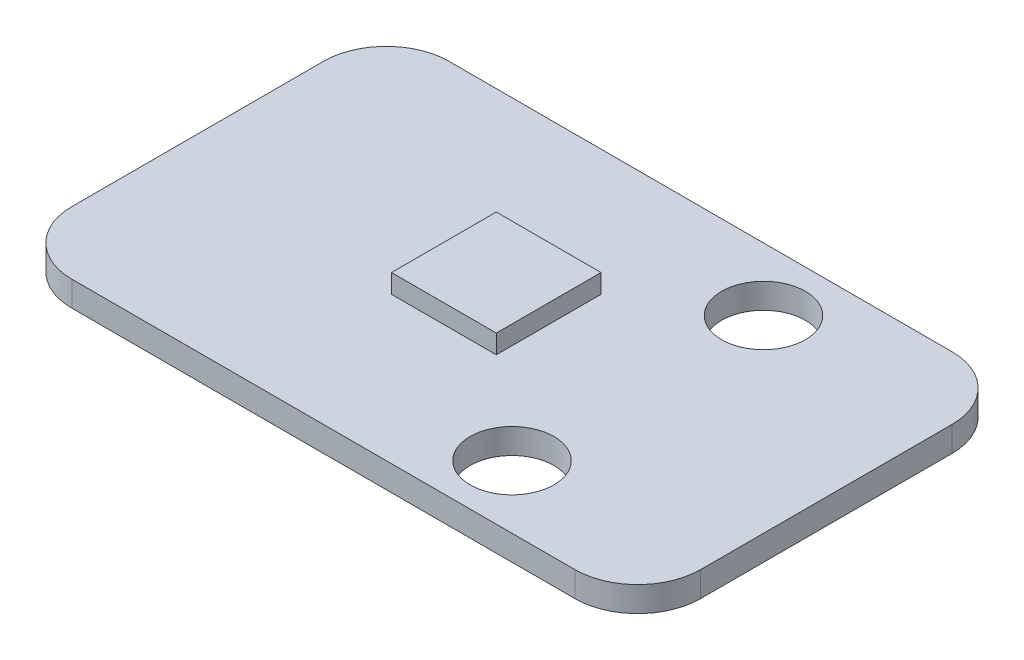
ISO-10303-21;
HEADER;
FILE_DESCRIPTION(('STEP AP214'),'2;1');
FILE_NAME('part.step','',(''),(''),'','','');
FILE_SCHEMA(('AUTOMOTIVE_DESIGN { 1 0 10303 214 1 1 1 1 }'));
ENDSEC;
DATA;
#1=APPLICATION_CONTEXT('core data for automotive mechanical design processes');
#2=APPLICATION_PROTOCOL_DEFINITION('international standard','automotive_design',2000,#1);
#3=PRODUCT_CONTEXT('',#1,'mechanical');
#4=PRODUCT('Part','Part','',(#3));
#5=PRODUCT_RELATED_PRODUCT_CATEGORY('part','',(#4));
#6=PRODUCT_DEFINITION_FORMATION('','',#4);
#7=PRODUCT_DEFINITION_CONTEXT('part definition',#1,'design');
#8=PRODUCT_DEFINITION('design','',#6,#7);
#9=PRODUCT_DEFINITION_SHAPE('','',#8);
#10=(LENGTH_UNIT() NAMED_UNIT(*) SI_UNIT(.MILLI.,.METRE.));
#11=(NAMED_UNIT(*) PLANE_ANGLE_UNIT() SI_UNIT($,.RADIAN.));
#12=(NAMED_UNIT(*) SI_UNIT($,.STERADIAN.) SOLID_ANGLE_UNIT());
#13=UNCERTAINTY_MEASURE_WITH_UNIT(LENGTH_MEASURE(1.E-05),#10,'distance_accuracy_value','');
#14=(GEOMETRIC_REPRESENTATION_CONTEXT(3) GLOBAL_UNCERTAINTY_ASSIGNED_CONTEXT((#13)) GLOBAL_UNIT_ASSIGNED_CONTEXT((#10,
#11,#12)) REPRESENTATION_CONTEXT('',''));
#15=CARTESIAN_POINT('',(0.,0.,0.));
#16=DIRECTION('',(0.,0.,1.));
#17=DIRECTION('',(1.,0.,0.));
#18=AXIS2_PLACEMENT_3D('',#15,#16,#17);
#19=CARTESIAN_POINT('',(-3.75,0.,2.));
#20=DIRECTION('',(0.,0.,1.));
#21=DIRECTION('',(1.,0.,0.));
#22=AXIS2_PLACEMENT_3D('',#19,#20,#21);
#23=PLANE('',#22);
#24=DIRECTION('',(0.,1.,0.));
#25=VECTOR('',#24,1.);
#26=CARTESIAN_POINT('',(1.25000000001,1.20000000001,2.00000000001));
#27=LINE('',#26,#25);
#28=CARTESIAN_POINT('',(1.25,1.20000000000001,2.));
#29=VERTEX_POINT('',#28);
#30=CARTESIAN_POINT('',(1.25,2.09999999999999,2.));
#31=VERTEX_POINT('',#30);
#32=EDGE_CURVE('E11',#29,#31,#27,.T.);
#33=ORIENTED_EDGE('',*,*,#32,.T.);
#34=DIRECTION('',(1.,0.,0.));
#35=VECTOR('',#34,1.);
#36=CARTESIAN_POINT('',(-3.75000000001,2.10000000001001,2.00000000001));
#37=LINE('',#36,#35);
#38=CARTESIAN_POINT('',(-3.75,2.09999999999999,2.));
#39=VERTEX_POINT('',#38);
#40=EDGE_CURVE('E38',#39,#31,#37,.T.);
#41=ORIENTED_EDGE('',*,*,#40,.F.);
#42=DIRECTION('',(0.,1.,0.));
#43=VECTOR('',#42,1.);
#44=CARTESIAN_POINT('',(-3.75000000001,1.20000000001,2.00000000001));
#45=LINE('',#44,#43);
#46=CARTESIAN_POINT('',(-3.75,1.20000000000001,2.));
#47=VERTEX_POINT('',#46);
#48=EDGE_CURVE('E105',#47,#39,#45,.T.);
#49=ORIENTED_EDGE('',*,*,#48,.F.);
#50=DIRECTION('',(1.,0.,0.));
#51=VECTOR('',#50,1.);
#52=CARTESIAN_POINT('',(-3.75000000001,1.20000000001,2.00000000001));
#53=LINE('',#52,#51);
#54=EDGE_CURVE('E26',#47,#29,#53,.T.);
#55=ORIENTED_EDGE('',*,*,#54,.T.);
#56=EDGE_LOOP('',(#33,#41,#49,#55));
#57=FACE_BOUND('',#56,.T.);
#58=ADVANCED_FACE('F16',(#57),#23,.T.);
#59=CARTESIAN_POINT('',(-3.75,0.,-3.));
#60=DIRECTION('',(-1.,0.,0.));
#61=DIRECTION('',(0.,0.,1.));
#62=AXIS2_PLACEMENT_3D('',#59,#60,#61);
#63=PLANE('',#62);
#64=ORIENTED_EDGE('',*,*,#48,.T.);
#65=DIRECTION('',(0.,0.,1.));
#66=VECTOR('',#65,1.);
#67=CARTESIAN_POINT('',(-3.75000000001,2.10000000001001,-3.00000000001));
#68=LINE('',#67,#66);
#69=CARTESIAN_POINT('',(-3.75,2.09999999999999,-3.));
#70=VERTEX_POINT('',#69);
#71=EDGE_CURVE('E152',#70,#39,#68,.T.);
#72=ORIENTED_EDGE('',*,*,#71,.F.);
#73=DIRECTION('',(0.,1.,0.));
#74=VECTOR('',#73,1.);
#75=CARTESIAN_POINT('',(-3.75000000001,1.20000000001,-3.00000000001));
#76=LINE('',#75,#74);
#77=CARTESIAN_POINT('',(-3.75,1.20000000000001,-3.));
#78=VERTEX_POINT('',#77);
#79=EDGE_CURVE('E201',#78,#70,#76,.T.);
#80=ORIENTED_EDGE('',*,*,#79,.F.);
#81=DIRECTION('',(0.,0.,1.));
#82=VECTOR('',#81,1.);
#83=CARTESIAN_POINT('',(-3.75000000001,1.20000000001,-3.00000000001));
#84=LINE('',#83,#82);
#85=EDGE_CURVE('E129',#78,#47,#84,.T.);
#86=ORIENTED_EDGE('',*,*,#85,.T.);
#87=EDGE_LOOP('',(#64,#72,#80,#86));
#88=FACE_BOUND('',#87,.T.);
#89=ADVANCED_FACE('F295',(#88),#63,.T.);
#90=CARTESIAN_POINT('',(1.25,0.,2.));
#91=DIRECTION('',(1.,0.,0.));
#92=DIRECTION('',(0.,1.,0.));
#93=AXIS2_PLACEMENT_3D('',#90,#91,#92);
#94=PLANE('',#93);
#95=DIRECTION('',(0.,1.,0.));
#96=VECTOR('',#95,1.);
#97=CARTESIAN_POINT('',(1.25000000001,1.20000000001,-3.00000000001));
#98=LINE('',#97,#96);
#99=CARTESIAN_POINT('',(1.25,1.20000000000001,-3.));
#100=VERTEX_POINT('',#99);
#101=CARTESIAN_POINT('',(1.25,2.09999999999999,-3.));
#102=VERTEX_POINT('',#101);
#103=EDGE_CURVE('E123',#100,#102,#98,.T.);
#104=ORIENTED_EDGE('',*,*,#103,.T.);
#105=DIRECTION('',(0.,0.,-1.));
#106=VECTOR('',#105,1.);
#107=CARTESIAN_POINT('',(1.25000000001,2.10000000001001,2.00000000001));
#108=LINE('',#107,#106);
#109=EDGE_CURVE('E117',#31,#102,#108,.T.);
#110=ORIENTED_EDGE('',*,*,#109,.F.);
#111=ORIENTED_EDGE('',*,*,#32,.F.);
#112=DIRECTION('',(0.,0.,-1.));
#113=VECTOR('',#112,1.);
#114=CARTESIAN_POINT('',(1.25000000001,1.20000000001,2.00000000001));
#115=LINE('',#114,#113);
#116=EDGE_CURVE('E115',#29,#100,#115,.T.);
#117=ORIENTED_EDGE('',*,*,#116,.T.);
#118=EDGE_LOOP('',(#104,#110,#111,#117));
#119=FACE_BOUND('',#118,.T.);
#120=ADVANCED_FACE('F114',(#119),#94,.T.);
#121=CARTESIAN_POINT('',(0.,0.,0.));
#122=DIRECTION('',(0.,1.,0.));
#123=DIRECTION('',(1.,0.,0.));
#124=AXIS2_PLACEMENT_3D('',#121,#122,#123);
#125=PLANE('',#124);
#126=DIRECTION('',(0.,0.,1.));
#127=VECTOR('',#126,1.);
#128=CARTESIAN_POINT('',(-15.00000000001,0.,-6.00000000001));
#129=LINE('',#128,#127);
#130=CARTESIAN_POINT('',(-15.,0.,-6.));
#131=VERTEX_POINT('',#130);
#132=CARTESIAN_POINT('',(-15.,0.,6.));
#133=VERTEX_POINT('',#132);
#134=EDGE_CURVE('E161',#131,#133,#129,.T.);
#135=ORIENTED_EDGE('',*,*,#134,.F.);
#136=CARTESIAN_POINT('',(-12.00000000001,0.,-6.00000000001));
#137=DIRECTION('',(0.,-1.,0.));
#138=DIRECTION('',(-1.,0.,0.));
#139=AXIS2_PLACEMENT_3D('',#136,#137,#138);
#140=CIRCLE('',#139,3.);
#141=CARTESIAN_POINT('',(-12.,0.,-9.));
#142=VERTEX_POINT('',#141);
#143=EDGE_CURVE('E124',#131,#142,#140,.T.);
#144=ORIENTED_EDGE('',*,*,#143,.T.);
#145=DIRECTION('',(-1.,0.,0.));
#146=VECTOR('',#145,1.);
#147=CARTESIAN_POINT('',(12.00000000001,0.,-9.00000000001));
#148=LINE('',#147,#146);
#149=CARTESIAN_POINT('',(12.,0.,-9.));
#150=VERTEX_POINT('',#149);
#151=EDGE_CURVE('E207',#150,#142,#148,.T.);
#152=ORIENTED_EDGE('',*,*,#151,.F.);
#153=CARTESIAN_POINT('',(12.00000000001,0.,-6.00000000001));
#154=DIRECTION('',(0.,-1.,0.));
#155=DIRECTION('',(0.,0.,-1.));
#156=AXIS2_PLACEMENT_3D('',#153,#154,#155);
#157=CIRCLE('',#156,3.);
#158=CARTESIAN_POINT('',(15.,0.,-6.));
#159=VERTEX_POINT('',#158);
#160=EDGE_CURVE('E132',#150,#159,#157,.T.);
#161=ORIENTED_EDGE('',*,*,#160,.T.);
#162=DIRECTION('',(0.,0.,-1.));
#163=VECTOR('',#162,1.);
#164=CARTESIAN_POINT('',(15.00000000001,0.,6.00000000001));
#165=LINE('',#164,#163);
#166=CARTESIAN_POINT('',(15.,0.,6.));
#167=VERTEX_POINT('',#166);
#168=EDGE_CURVE('E215',#167,#159,#165,.T.);
#169=ORIENTED_EDGE('',*,*,#168,.F.);
#170=CARTESIAN_POINT('',(12.00000000001,0.,6.00000000001));
#171=DIRECTION('',(0.,-1.,0.));
#172=DIRECTION('',(1.,0.,0.));
#173=AXIS2_PLACEMENT_3D('',#170,#171,#172);
#174=CIRCLE('',#173,3.);
#175=CARTESIAN_POINT('',(12.,0.,9.));
#176=VERTEX_POINT('',#175);
#177=EDGE_CURVE('E174',#167,#176,#174,.T.);
#178=ORIENTED_EDGE('',*,*,#177,.T.);
#179=DIRECTION('',(1.,0.,0.));
#180=VECTOR('',#179,1.);
#181=CARTESIAN_POINT('',(-12.00000000001,0.,9.00000000001));
#182=LINE('',#181,#180);
#183=CARTESIAN_POINT('',(-12.,0.,9.));
#184=VERTEX_POINT('',#183);
#185=EDGE_CURVE('E147',#184,#176,#182,.T.);
#186=ORIENTED_EDGE('',*,*,#185,.F.);
#187=CARTESIAN_POINT('',(-12.00000000001,0.,6.00000000001));
#188=DIRECTION('',(0.,-1.,0.));
#189=DIRECTION('',(0.,0.,1.));
#190=AXIS2_PLACEMENT_3D('',#187,#188,#189);
#191=CIRCLE('',#190,3.);
#192=EDGE_CURVE('E206',#184,#133,#191,.T.);
#193=ORIENTED_EDGE('',*,*,#192,.T.);
#194=EDGE_LOOP('',(#135,#144,#152,#161,#169,#178,#186,#193));
#195=FACE_BOUND('',#194,.T.);
#196=CARTESIAN_POINT('',(6.00000000001,0.,6.00000000001));
#197=DIRECTION('',(0.,1.,0.));
#198=DIRECTION('',(-1.,0.,0.));
#199=AXIS2_PLACEMENT_3D('',#196,#197,#198);
#200=CIRCLE('',#199,2.);
#201=CARTESIAN_POINT('',(4.00000000001,0.,6.00000000001));
#202=VERTEX_POINT('',#201);
#203=EDGE_CURVE('E20',#202,#202,#200,.T.);
#204=ORIENTED_EDGE('',*,*,#203,.T.);
#205=EDGE_LOOP('',(#204));
#206=FACE_BOUND('',#205,.T.);
#207=CARTESIAN_POINT('',(6.00000000001,0.,-6.00000000001));
#208=DIRECTION('',(0.,1.,0.));
#209=DIRECTION('',(-1.,0.,0.));
#210=AXIS2_PLACEMENT_3D('',#207,#208,#209);
#211=CIRCLE('',#210,2.);
#212=CARTESIAN_POINT('',(4.00000000001,0.,-6.00000000001));
#213=VERTEX_POINT('',#212);
#214=EDGE_CURVE('E228',#213,#213,#211,.T.);
#215=ORIENTED_EDGE('',*,*,#214,.T.);
#216=EDGE_LOOP('',(#215));
#217=FACE_BOUND('',#216,.T.);
#218=ADVANCED_FACE('F263',(#195,#206,#217),#125,.F.);
#219=CARTESIAN_POINT('',(-12.,4.92864000000001,6.));
#220=DIRECTION('',(0.,1.,0.));
#221=DIRECTION('',(0.,0.,1.));
#222=AXIS2_PLACEMENT_3D('',#219,#220,#221);
#223=CYLINDRICAL_SURFACE('',#222,3.);
#224=DIRECTION('',(0.,-1.,0.));
#225=VECTOR('',#224,1.);
#226=CARTESIAN_POINT('',(-12.00000000001,1.20000000001,9.00000000001));
#227=LINE('',#226,#225);
#228=CARTESIAN_POINT('',(-12.,1.20000000000001,9.));
#229=VERTEX_POINT('',#228);
#230=EDGE_CURVE('E155',#229,#184,#227,.T.);
#231=ORIENTED_EDGE('',*,*,#230,.F.);
#232=CARTESIAN_POINT('',(-12.00000000001,1.20000000001,6.00000000001));
#233=DIRECTION('',(0.,1.,0.));
#234=DIRECTION('',(-1.,0.,0.));
#235=AXIS2_PLACEMENT_3D('',#232,#233,#234);
#236=CIRCLE('',#235,3.);
#237=CARTESIAN_POINT('',(-15.,1.20000000000001,6.));
#238=VERTEX_POINT('',#237);
#239=EDGE_CURVE('E138',#238,#229,#236,.T.);
#240=ORIENTED_EDGE('',*,*,#239,.F.);
#241=DIRECTION('',(0.,-1.,0.));
#242=VECTOR('',#241,1.);
#243=CARTESIAN_POINT('',(-15.00000000001,1.20000000001,6.00000000001));
#244=LINE('',#243,#242);
#245=EDGE_CURVE('E160',#238,#133,#244,.T.);
#246=ORIENTED_EDGE('',*,*,#245,.T.);
#247=ORIENTED_EDGE('',*,*,#192,.F.);
#248=EDGE_LOOP('',(#231,#240,#246,#247));
#249=FACE_BOUND('',#248,.T.);
#250=ADVANCED_FACE('F320',(#249),#223,.T.);
#251=CARTESIAN_POINT('',(-15.,0.,-9.00000000000001));
#252=DIRECTION('',(-1.,0.,0.));
#253=DIRECTION('',(0.,0.,1.));
#254=AXIS2_PLACEMENT_3D('',#251,#252,#253);
#255=PLANE('',#254);
#256=DIRECTION('',(0.,0.,1.));
#257=VECTOR('',#256,1.);
#258=CARTESIAN_POINT('',(-15.00000000001,1.20000000001,-6.00000000001));
#259=LINE('',#258,#257);
#260=CARTESIAN_POINT('',(-15.,1.20000000000001,-6.));
#261=VERTEX_POINT('',#260);
#262=EDGE_CURVE('E142',#261,#238,#259,.T.);
#263=ORIENTED_EDGE('',*,*,#262,.F.);
#264=DIRECTION('',(0.,-1.,0.));
#265=VECTOR('',#264,1.);
#266=CARTESIAN_POINT('',(-15.00000000001,1.20000000001,-6.00000000001));
#267=LINE('',#266,#265);
#268=EDGE_CURVE('E156',#261,#131,#267,.T.);
#269=ORIENTED_EDGE('',*,*,#268,.T.);
#270=ORIENTED_EDGE('',*,*,#134,.T.);
#271=ORIENTED_EDGE('',*,*,#245,.F.);
#272=EDGE_LOOP('',(#263,#269,#270,#271));
#273=FACE_BOUND('',#272,.T.);
#274=ADVANCED_FACE('F311',(#273),#255,.T.);
#275=CARTESIAN_POINT('',(-12.,4.92864000000001,-6.));
#276=DIRECTION('',(0.,1.,0.));
#277=DIRECTION('',(-1.,0.,0.));
#278=AXIS2_PLACEMENT_3D('',#275,#276,#277);
#279=CYLINDRICAL_SURFACE('',#278,3.);
#280=ORIENTED_EDGE('',*,*,#268,.F.);
#281=CARTESIAN_POINT('',(-12.00000000001,1.20000000001,-6.00000000001));
#282=DIRECTION('',(0.,1.,0.));
#283=DIRECTION('',(0.,0.,-1.));
#284=AXIS2_PLACEMENT_3D('',#281,#282,#283);
#285=CIRCLE('',#284,3.);
#286=CARTESIAN_POINT('',(-12.,1.20000000000001,-9.));
#287=VERTEX_POINT('',#286);
#288=EDGE_CURVE('E166',#287,#261,#285,.T.);
#289=ORIENTED_EDGE('',*,*,#288,.F.);
#290=DIRECTION('',(0.,-1.,0.));
#291=VECTOR('',#290,1.);
#292=CARTESIAN_POINT('',(-12.00000000001,1.20000000001,-9.00000000001));
#293=LINE('',#292,#291);
#294=EDGE_CURVE('E211',#287,#142,#293,.T.);
#295=ORIENTED_EDGE('',*,*,#294,.T.);
#296=ORIENTED_EDGE('',*,*,#143,.F.);
#297=EDGE_LOOP('',(#280,#289,#295,#296));
#298=FACE_BOUND('',#297,.T.);
#299=ADVANCED_FACE('F309',(#298),#279,.T.);
#300=CARTESIAN_POINT('',(15.,0.,-9.));
#301=DIRECTION('',(0.,0.,-1.));
#302=DIRECTION('',(0.,-1.,0.));
#303=AXIS2_PLACEMENT_3D('',#300,#301,#302);
#304=PLANE('',#303);
#305=ORIENTED_EDGE('',*,*,#151,.T.);
#306=ORIENTED_EDGE('',*,*,#294,.F.);
#307=DIRECTION('',(-1.,0.,0.));
#308=VECTOR('',#307,1.);
#309=CARTESIAN_POINT('',(12.00000000001,1.20000000001,-9.00000000001));
#310=LINE('',#309,#308);
#311=CARTESIAN_POINT('',(12.,1.20000000000001,-9.));
#312=VERTEX_POINT('',#311);
#313=EDGE_CURVE('E170',#312,#287,#310,.T.);
#314=ORIENTED_EDGE('',*,*,#313,.F.);
#315=DIRECTION('',(0.,-1.,0.));
#316=VECTOR('',#315,1.);
#317=CARTESIAN_POINT('',(12.00000000001,1.20000000001,-9.00000000001));
#318=LINE('',#317,#316);
#319=EDGE_CURVE('E212',#312,#150,#318,.T.);
#320=ORIENTED_EDGE('',*,*,#319,.T.);
#321=EDGE_LOOP('',(#305,#306,#314,#320));
#322=FACE_BOUND('',#321,.T.);
#323=ADVANCED_FACE('F275',(#322),#304,.T.);
#324=CARTESIAN_POINT('',(0.,1.20000000000001,0.));
#325=DIRECTION('',(0.,1.,0.));
#326=DIRECTION('',(1.,0.,0.));
#327=AXIS2_PLACEMENT_3D('',#324,#325,#326);
#328=PLANE('',#327);
#329=DIRECTION('',(1.,0.,0.));
#330=VECTOR('',#329,1.);
#331=CARTESIAN_POINT('',(-12.00000000001,1.20000000001,9.00000000001));
#332=LINE('',#331,#330);
#333=CARTESIAN_POINT('',(12.,1.20000000000001,9.));
#334=VERTEX_POINT('',#333);
#335=EDGE_CURVE('E192',#229,#334,#332,.T.);
#336=ORIENTED_EDGE('',*,*,#335,.T.);
#337=CARTESIAN_POINT('',(12.00000000001,1.20000000001,6.00000000001));
#338=DIRECTION('',(0.,1.,0.));
#339=DIRECTION('',(0.,0.,1.));
#340=AXIS2_PLACEMENT_3D('',#337,#338,#339);
#341=CIRCLE('',#340,3.);
#342=CARTESIAN_POINT('',(15.,1.20000000000001,6.));
#343=VERTEX_POINT('',#342);
#344=EDGE_CURVE('E185',#334,#343,#341,.T.);
#345=ORIENTED_EDGE('',*,*,#344,.T.);
#346=DIRECTION('',(0.,0.,-1.));
#347=VECTOR('',#346,1.);
#348=CARTESIAN_POINT('',(15.00000000001,1.20000000001,6.00000000001));
#349=LINE('',#348,#347);
#350=CARTESIAN_POINT('',(15.,1.20000000000001,-6.));
#351=VERTEX_POINT('',#350);
#352=EDGE_CURVE('E136',#343,#351,#349,.T.);
#353=ORIENTED_EDGE('',*,*,#352,.T.);
#354=CARTESIAN_POINT('',(12.00000000001,1.20000000001,-6.00000000001));
#355=DIRECTION('',(0.,1.,0.));
#356=DIRECTION('',(1.,0.,0.));
#357=AXIS2_PLACEMENT_3D('',#354,#355,#356);
#358=CIRCLE('',#357,3.);
#359=EDGE_CURVE('E175',#351,#312,#358,.T.);
#360=ORIENTED_EDGE('',*,*,#359,.T.);
#361=ORIENTED_EDGE('',*,*,#313,.T.);
#362=ORIENTED_EDGE('',*,*,#288,.T.);
#363=ORIENTED_EDGE('',*,*,#262,.T.);
#364=ORIENTED_EDGE('',*,*,#239,.T.);
#365=EDGE_LOOP('',(#336,#345,#353,#360,#361,#362,#363,#364));
#366=FACE_BOUND('',#365,.T.);
#367=CARTESIAN_POINT('',(6.00000000001,1.20000000001,6.00000000001));
#368=DIRECTION('',(0.,1.,0.));
#369=DIRECTION('',(-1.,0.,0.));
#370=AXIS2_PLACEMENT_3D('',#367,#368,#369);
#371=CIRCLE('',#370,2.);
#372=CARTESIAN_POINT('',(4.00000000001,1.20000000001,6.00000000001));
#373=VERTEX_POINT('',#372);
#374=EDGE_CURVE('E143',#373,#373,#371,.T.);
#375=ORIENTED_EDGE('',*,*,#374,.F.);
#376=EDGE_LOOP('',(#375));
#377=FACE_BOUND('',#376,.T.);
#378=CARTESIAN_POINT('',(6.00000000001,1.20000000001,-6.00000000001));
#379=DIRECTION('',(0.,1.,0.));
#380=DIRECTION('',(-1.,0.,0.));
#381=AXIS2_PLACEMENT_3D('',#378,#379,#380);
#382=CIRCLE('',#381,2.);
#383=CARTESIAN_POINT('',(4.00000000001,1.20000000001,-6.00000000001));
#384=VERTEX_POINT('',#383);
#385=EDGE_CURVE('E198',#384,#384,#382,.T.);
#386=ORIENTED_EDGE('',*,*,#385,.F.);
#387=EDGE_LOOP('',(#386));
#388=FACE_BOUND('',#387,.T.);
#389=ORIENTED_EDGE('',*,*,#54,.F.);
#390=ORIENTED_EDGE('',*,*,#85,.F.);
#391=DIRECTION('',(-1.,0.,0.));
#392=VECTOR('',#391,1.);
#393=CARTESIAN_POINT('',(1.25000000001,1.20000000001,-3.00000000001));
#394=LINE('',#393,#392);
#395=EDGE_CURVE('E121',#100,#78,#394,.T.);
#396=ORIENTED_EDGE('',*,*,#395,.F.);
#397=ORIENTED_EDGE('',*,*,#116,.F.);
#398=EDGE_LOOP('',(#389,#390,#396,#397));
#399=FACE_BOUND('',#398,.T.);
#400=ADVANCED_FACE('F119',(#366,#377,#388,#399),#328,.T.);
#401=CARTESIAN_POINT('',(6.,0.,6.));
#402=DIRECTION('',(0.,-1.,0.));
#403=DIRECTION('',(1.,0.,0.));
#404=AXIS2_PLACEMENT_3D('',#401,#402,#403);
#405=CYLINDRICAL_SURFACE('',#404,2.);
#406=ORIENTED_EDGE('',*,*,#203,.F.);
#407=EDGE_LOOP('',(#406));
#408=FACE_BOUND('',#407,.T.);
#409=ORIENTED_EDGE('',*,*,#374,.T.);
#410=EDGE_LOOP('',(#409));
#411=FACE_BOUND('',#410,.T.);
#412=ADVANCED_FACE('F266',(#408,#411),#405,.F.);
#413=CARTESIAN_POINT('',(-15.,0.,9.));
#414=DIRECTION('',(0.,0.,1.));
#415=DIRECTION('',(1.,0.,0.));
#416=AXIS2_PLACEMENT_3D('',#413,#414,#415);
#417=PLANE('',#416);
#418=ORIENTED_EDGE('',*,*,#185,.T.);
#419=DIRECTION('',(0.,-1.,0.));
#420=VECTOR('',#419,1.);
#421=CARTESIAN_POINT('',(12.00000000001,1.20000000001,9.00000000001));
#422=LINE('',#421,#420);
#423=EDGE_CURVE('E199',#334,#176,#422,.T.);
#424=ORIENTED_EDGE('',*,*,#423,.F.);
#425=ORIENTED_EDGE('',*,*,#335,.F.);
#426=ORIENTED_EDGE('',*,*,#230,.T.);
#427=EDGE_LOOP('',(#418,#424,#425,#426));
#428=FACE_BOUND('',#427,.T.);
#429=ADVANCED_FACE('F269',(#428),#417,.T.);
#430=CARTESIAN_POINT('',(6.,0.,-6.));
#431=DIRECTION('',(0.,-1.,0.));
#432=DIRECTION('',(1.,0.,0.));
#433=AXIS2_PLACEMENT_3D('',#430,#431,#432);
#434=CYLINDRICAL_SURFACE('',#433,2.);
#435=ORIENTED_EDGE('',*,*,#214,.F.);
#436=EDGE_LOOP('',(#435));
#437=FACE_BOUND('',#436,.T.);
#438=ORIENTED_EDGE('',*,*,#385,.T.);
#439=EDGE_LOOP('',(#438));
#440=FACE_BOUND('',#439,.T.);
#441=ADVANCED_FACE('F279',(#437,#440),#434,.F.);
#442=CARTESIAN_POINT('',(12.,4.92863999999998,-6.));
#443=DIRECTION('',(0.,1.,0.));
#444=DIRECTION('',(0.,0.,-1.));
#445=AXIS2_PLACEMENT_3D('',#442,#443,#444);
#446=CYLINDRICAL_SURFACE('',#445,3.);
#447=ORIENTED_EDGE('',*,*,#319,.F.);
#448=ORIENTED_EDGE('',*,*,#359,.F.);
#449=DIRECTION('',(0.,-1.,0.));
#450=VECTOR('',#449,1.);
#451=CARTESIAN_POINT('',(15.00000000001,1.20000000001,-6.00000000001));
#452=LINE('',#451,#450);
#453=EDGE_CURVE('E194',#351,#159,#452,.T.);
#454=ORIENTED_EDGE('',*,*,#453,.T.);
#455=ORIENTED_EDGE('',*,*,#160,.F.);
#456=EDGE_LOOP('',(#447,#448,#454,#455));
#457=FACE_BOUND('',#456,.T.);
#458=ADVANCED_FACE('F281',(#457),#446,.T.);
#459=CARTESIAN_POINT('',(12.,4.92863999999998,6.));
#460=DIRECTION('',(0.,1.,0.));
#461=DIRECTION('',(1.,0.,0.));
#462=AXIS2_PLACEMENT_3D('',#459,#460,#461);
#463=CYLINDRICAL_SURFACE('',#462,3.);
#464=DIRECTION('',(0.,-1.,0.));
#465=VECTOR('',#464,1.);
#466=CARTESIAN_POINT('',(15.00000000001,1.20000000001,6.00000000001));
#467=LINE('',#466,#465);
#468=EDGE_CURVE('E218',#343,#167,#467,.T.);
#469=ORIENTED_EDGE('',*,*,#468,.F.);
#470=ORIENTED_EDGE('',*,*,#344,.F.);
#471=ORIENTED_EDGE('',*,*,#423,.T.);
#472=ORIENTED_EDGE('',*,*,#177,.F.);
#473=EDGE_LOOP('',(#469,#470,#471,#472));
#474=FACE_BOUND('',#473,.T.);
#475=ADVANCED_FACE('F18',(#474),#463,.T.);
#476=CARTESIAN_POINT('',(15.,0.,9.));
#477=DIRECTION('',(1.,0.,0.));
#478=DIRECTION('',(0.,1.,0.));
#479=AXIS2_PLACEMENT_3D('',#476,#477,#478);
#480=PLANE('',#479);
#481=ORIENTED_EDGE('',*,*,#168,.T.);
#482=ORIENTED_EDGE('',*,*,#453,.F.);
#483=ORIENTED_EDGE('',*,*,#352,.F.);
#484=ORIENTED_EDGE('',*,*,#468,.T.);
#485=EDGE_LOOP('',(#481,#482,#483,#484));
#486=FACE_BOUND('',#485,.T.);
#487=ADVANCED_FACE('F314',(#486),#480,.T.);
#488=CARTESIAN_POINT('',(1.25,0.,-3.));
#489=DIRECTION('',(0.,0.,-1.));
#490=DIRECTION('',(0.,-1.,0.));
#491=AXIS2_PLACEMENT_3D('',#488,#489,#490);
#492=PLANE('',#491);
#493=ORIENTED_EDGE('',*,*,#79,.T.);
#494=DIRECTION('',(-1.,0.,0.));
#495=VECTOR('',#494,1.);
#496=CARTESIAN_POINT('',(1.25000000001,2.10000000001001,-3.00000000001));
#497=LINE('',#496,#495);
#498=EDGE_CURVE('E148',#102,#70,#497,.T.);
#499=ORIENTED_EDGE('',*,*,#498,.F.);
#500=ORIENTED_EDGE('',*,*,#103,.F.);
#501=ORIENTED_EDGE('',*,*,#395,.T.);
#502=EDGE_LOOP('',(#493,#499,#500,#501));
#503=FACE_BOUND('',#502,.T.);
#504=ADVANCED_FACE('F306',(#503),#492,.T.);
#505=CARTESIAN_POINT('',(0.,2.09999999999999,0.));
#506=DIRECTION('',(0.,1.,0.));
#507=DIRECTION('',(1.,0.,0.));
#508=AXIS2_PLACEMENT_3D('',#505,#506,#507);
#509=PLANE('',#508);
#510=ORIENTED_EDGE('',*,*,#498,.T.);
#511=ORIENTED_EDGE('',*,*,#71,.T.);
#512=ORIENTED_EDGE('',*,*,#40,.T.);
#513=ORIENTED_EDGE('',*,*,#109,.T.);
#514=EDGE_LOOP('',(#510,#511,#512,#513));
#515=FACE_BOUND('',#514,.T.);
#516=ADVANCED_FACE('F303',(#515),#509,.T.);
#517=CLOSED_SHELL('',(#58,#89,#120,#218,#250,#274,#299,#323,#400,#412,#429,#441,#458,#475,#487,
#504,#516));
#518=MANIFOLD_SOLID_BREP('B1',#517);
#519=ADVANCED_BREP_SHAPE_REPRESENTATION('',(#18,#518),#14);
#520=SHAPE_DEFINITION_REPRESENTATION(#9,#519);
ENDSEC;
END-ISO-10303-21;
